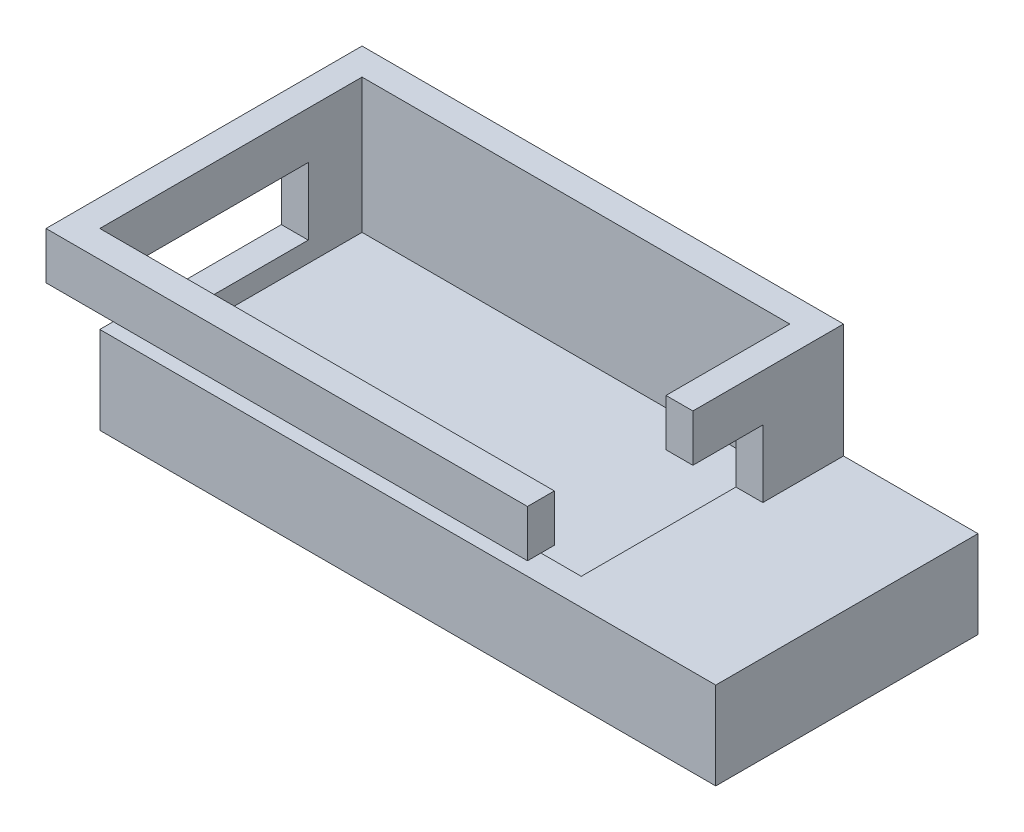
ISO-10303-21;
HEADER;
FILE_DESCRIPTION(('STEP AP214'),'2;1');
FILE_NAME('part.step','',(''),(''),'','','');
FILE_SCHEMA(('AUTOMOTIVE_DESIGN { 1 0 10303 214 1 1 1 1 }'));
ENDSEC;
DATA;
#1=APPLICATION_CONTEXT('core data for automotive mechanical design processes');
#2=APPLICATION_PROTOCOL_DEFINITION('international standard','automotive_design',2000,#1);
#3=PRODUCT_CONTEXT('',#1,'mechanical');
#4=PRODUCT('Part','Part','',(#3));
#5=PRODUCT_RELATED_PRODUCT_CATEGORY('part','',(#4));
#6=PRODUCT_DEFINITION_FORMATION('','',#4);
#7=PRODUCT_DEFINITION_CONTEXT('part definition',#1,'design');
#8=PRODUCT_DEFINITION('design','',#6,#7);
#9=PRODUCT_DEFINITION_SHAPE('','',#8);
#10=(LENGTH_UNIT() NAMED_UNIT(*) SI_UNIT(.MILLI.,.METRE.));
#11=(NAMED_UNIT(*) PLANE_ANGLE_UNIT() SI_UNIT($,.RADIAN.));
#12=(NAMED_UNIT(*) SI_UNIT($,.STERADIAN.) SOLID_ANGLE_UNIT());
#13=UNCERTAINTY_MEASURE_WITH_UNIT(LENGTH_MEASURE(1.E-05),#10,'distance_accuracy_value','');
#14=(GEOMETRIC_REPRESENTATION_CONTEXT(3) GLOBAL_UNCERTAINTY_ASSIGNED_CONTEXT((#13)) GLOBAL_UNIT_ASSIGNED_CONTEXT((#10,
#11,#12)) REPRESENTATION_CONTEXT('',''));
#15=CARTESIAN_POINT('',(0.,0.,0.));
#16=DIRECTION('',(0.,0.,1.));
#17=DIRECTION('',(1.,0.,0.));
#18=AXIS2_PLACEMENT_3D('',#15,#16,#17);
#19=CARTESIAN_POINT('',(-2.,6.5,-53.6474757071638));
#20=DIRECTION('',(0.,1.,0.));
#21=DIRECTION('',(-1.,0.,0.));
#22=AXIS2_PLACEMENT_3D('',#19,#20,#21);
#23=PLANE('',#22);
#24=DIRECTION('',(0.,0.,1.));
#25=VECTOR('',#24,1.);
#26=CARTESIAN_POINT('',(0.,6.5,0.));
#27=LINE('',#26,#25);
#28=CARTESIAN_POINT('',(0.,6.5,-11.5));
#29=VERTEX_POINT('',#28);
#30=CARTESIAN_POINT('',(0.,6.5,4.));
#31=VERTEX_POINT('',#30);
#32=EDGE_CURVE('E309',#29,#31,#27,.T.);
#33=ORIENTED_EDGE('',*,*,#32,.T.);
#34=DIRECTION('',(-1.,0.,0.));
#35=VECTOR('',#34,1.);
#36=CARTESIAN_POINT('',(0.,6.5,4.));
#37=LINE('',#36,#35);
#38=CARTESIAN_POINT('',(33.8,6.5,4.));
#39=VERTEX_POINT('',#38);
#40=EDGE_CURVE('E220',#39,#31,#37,.T.);
#41=ORIENTED_EDGE('',*,*,#40,.F.);
#42=DIRECTION('',(0.,0.,1.));
#43=VECTOR('',#42,1.);
#44=CARTESIAN_POINT('',(33.8,6.5,0.));
#45=LINE('',#44,#43);
#46=CARTESIAN_POINT('',(33.8,6.5,6.));
#47=VERTEX_POINT('',#46);
#48=EDGE_CURVE('E227',#39,#47,#45,.T.);
#49=ORIENTED_EDGE('',*,*,#48,.T.);
#50=DIRECTION('',(-1.,0.,0.));
#51=VECTOR('',#50,1.);
#52=CARTESIAN_POINT('',(0.,6.5,6.));
#53=LINE('',#52,#51);
#54=CARTESIAN_POINT('',(-2.,6.5,6.));
#55=VERTEX_POINT('',#54);
#56=EDGE_CURVE('E189',#47,#55,#53,.T.);
#57=ORIENTED_EDGE('',*,*,#56,.T.);
#58=DIRECTION('',(0.,0.,1.));
#59=VECTOR('',#58,1.);
#60=CARTESIAN_POINT('',(-2.,6.5,-53.6474757071638));
#61=LINE('',#60,#59);
#62=CARTESIAN_POINT('',(-2.,6.5,-11.5));
#63=VERTEX_POINT('',#62);
#64=EDGE_CURVE('E274',#63,#55,#61,.T.);
#65=ORIENTED_EDGE('',*,*,#64,.F.);
#66=DIRECTION('',(1.,0.,0.));
#67=VECTOR('',#66,1.);
#68=CARTESIAN_POINT('',(-2.,6.5,-11.5));
#69=LINE('',#68,#67);
#70=EDGE_CURVE('E275',#63,#29,#69,.T.);
#71=ORIENTED_EDGE('',*,*,#70,.T.);
#72=EDGE_LOOP('',(#33,#41,#49,#57,#65,#71));
#73=FACE_BOUND('',#72,.T.);
#74=ADVANCED_FACE('F49',(#73),#23,.F.);
#75=CARTESIAN_POINT('',(0.,10.,0.));
#76=DIRECTION('',(0.,1.,0.));
#77=DIRECTION('',(0.,0.,1.));
#78=AXIS2_PLACEMENT_3D('',#75,#76,#77);
#79=PLANE('',#78);
#80=DIRECTION('',(1.,0.,0.));
#81=VECTOR('',#80,1.);
#82=CARTESIAN_POINT('',(-9.00777441991085,10.,-6.30000000000001));
#83=LINE('',#82,#81);
#84=CARTESIAN_POINT('',(31.8,10.,-6.30000000000001));
#85=VERTEX_POINT('',#84);
#86=CARTESIAN_POINT('',(33.8,10.,-6.30000000000001));
#87=VERTEX_POINT('',#86);
#88=EDGE_CURVE('E263',#85,#87,#83,.T.);
#89=ORIENTED_EDGE('',*,*,#88,.T.);
#90=DIRECTION('',(0.,0.,-1.));
#91=VECTOR('',#90,1.);
#92=CARTESIAN_POINT('',(33.8,10.,2.));
#93=LINE('',#92,#91);
#94=CARTESIAN_POINT('',(33.8,10.,-17.5));
#95=VERTEX_POINT('',#94);
#96=EDGE_CURVE('E359',#87,#95,#93,.T.);
#97=ORIENTED_EDGE('',*,*,#96,.T.);
#98=DIRECTION('',(-1.,0.,0.));
#99=VECTOR('',#98,1.);
#100=CARTESIAN_POINT('',(-2.,10.,-17.5));
#101=LINE('',#100,#99);
#102=CARTESIAN_POINT('',(-2.,10.,-17.5));
#103=VERTEX_POINT('',#102);
#104=EDGE_CURVE('E362',#95,#103,#101,.T.);
#105=ORIENTED_EDGE('',*,*,#104,.T.);
#106=DIRECTION('',(0.,0.,1.));
#107=VECTOR('',#106,1.);
#108=CARTESIAN_POINT('',(-2.,10.,2.));
#109=LINE('',#108,#107);
#110=CARTESIAN_POINT('',(-2.,10.,6.));
#111=VERTEX_POINT('',#110);
#112=EDGE_CURVE('E208',#103,#111,#109,.T.);
#113=ORIENTED_EDGE('',*,*,#112,.T.);
#114=DIRECTION('',(1.,0.,0.));
#115=VECTOR('',#114,1.);
#116=CARTESIAN_POINT('',(0.,10.,6.));
#117=LINE('',#116,#115);
#118=CARTESIAN_POINT('',(33.8,10.,6.));
#119=VERTEX_POINT('',#118);
#120=EDGE_CURVE('E187',#111,#119,#117,.T.);
#121=ORIENTED_EDGE('',*,*,#120,.T.);
#122=DIRECTION('',(0.,0.,-1.));
#123=VECTOR('',#122,1.);
#124=CARTESIAN_POINT('',(33.8,10.,0.));
#125=LINE('',#124,#123);
#126=CARTESIAN_POINT('',(33.8,10.,4.));
#127=VERTEX_POINT('',#126);
#128=EDGE_CURVE('E197',#119,#127,#125,.T.);
#129=ORIENTED_EDGE('',*,*,#128,.T.);
#130=DIRECTION('',(1.,0.,0.));
#131=VECTOR('',#130,1.);
#132=CARTESIAN_POINT('',(0.,10.,4.));
#133=LINE('',#132,#131);
#134=CARTESIAN_POINT('',(0.,10.,4.));
#135=VERTEX_POINT('',#134);
#136=EDGE_CURVE('E194',#135,#127,#133,.T.);
#137=ORIENTED_EDGE('',*,*,#136,.F.);
#138=DIRECTION('',(0.,0.,1.));
#139=VECTOR('',#138,1.);
#140=CARTESIAN_POINT('',(0.,10.,0.));
#141=LINE('',#140,#139);
#142=CARTESIAN_POINT('',(0.,10.,-15.5));
#143=VERTEX_POINT('',#142);
#144=EDGE_CURVE('E323',#143,#135,#141,.T.);
#145=ORIENTED_EDGE('',*,*,#144,.F.);
#146=DIRECTION('',(-1.,0.,0.));
#147=VECTOR('',#146,1.);
#148=CARTESIAN_POINT('',(0.,10.,-15.5));
#149=LINE('',#148,#147);
#150=CARTESIAN_POINT('',(31.8,10.,-15.5));
#151=VERTEX_POINT('',#150);
#152=EDGE_CURVE('E330',#151,#143,#149,.T.);
#153=ORIENTED_EDGE('',*,*,#152,.F.);
#154=DIRECTION('',(0.,0.,-1.));
#155=VECTOR('',#154,1.);
#156=CARTESIAN_POINT('',(31.8,10.,0.));
#157=LINE('',#156,#155);
#158=EDGE_CURVE('E326',#85,#151,#157,.T.);
#159=ORIENTED_EDGE('',*,*,#158,.F.);
#160=EDGE_LOOP('',(#89,#97,#105,#113,#121,#129,#137,#145,#153,#159));
#161=FACE_BOUND('',#160,.T.);
#162=ADVANCED_FACE('F206',(#161),#79,.T.);
#163=CARTESIAN_POINT('',(-2.,10.,2.));
#164=DIRECTION('',(0.,0.,-1.));
#165=DIRECTION('',(-1.,0.,0.));
#166=AXIS2_PLACEMENT_3D('',#163,#164,#165);
#167=PLANE('',#166);
#168=DIRECTION('',(1.,0.,0.));
#169=VECTOR('',#168,1.);
#170=CARTESIAN_POINT('',(0.,-5.,2.));
#171=LINE('',#170,#169);
#172=CARTESIAN_POINT('',(-2.,-5.,2.));
#173=VERTEX_POINT('',#172);
#174=CARTESIAN_POINT('',(43.8,-5.,2.));
#175=VERTEX_POINT('',#174);
#176=EDGE_CURVE('E316',#173,#175,#171,.T.);
#177=ORIENTED_EDGE('',*,*,#176,.T.);
#178=DIRECTION('',(0.,-1.,0.));
#179=VECTOR('',#178,1.);
#180=CARTESIAN_POINT('',(43.8,23.4146070008111,2.));
#181=LINE('',#180,#179);
#182=CARTESIAN_POINT('',(43.8,1.5,2.));
#183=VERTEX_POINT('',#182);
#184=EDGE_CURVE('E254',#183,#175,#181,.T.);
#185=ORIENTED_EDGE('',*,*,#184,.F.);
#186=DIRECTION('',(1.,0.,0.));
#187=VECTOR('',#186,1.);
#188=CARTESIAN_POINT('',(-2.,1.5,2.));
#189=LINE('',#188,#187);
#190=CARTESIAN_POINT('',(-2.,1.5,2.));
#191=VERTEX_POINT('',#190);
#192=EDGE_CURVE('E268',#191,#183,#189,.T.);
#193=ORIENTED_EDGE('',*,*,#192,.F.);
#194=DIRECTION('',(0.,-1.,0.));
#195=VECTOR('',#194,1.);
#196=CARTESIAN_POINT('',(-2.,10.,2.));
#197=LINE('',#196,#195);
#198=EDGE_CURVE('E367',#191,#173,#197,.T.);
#199=ORIENTED_EDGE('',*,*,#198,.T.);
#200=EDGE_LOOP('',(#177,#185,#193,#199));
#201=FACE_BOUND('',#200,.T.);
#202=ADVANCED_FACE('F51',(#201),#167,.F.);
#203=CARTESIAN_POINT('',(33.8,10.,2.));
#204=DIRECTION('',(-1.,0.,0.));
#205=DIRECTION('',(0.,0.,1.));
#206=AXIS2_PLACEMENT_3D('',#203,#204,#205);
#207=PLANE('',#206);
#208=DIRECTION('',(0.,-1.,0.));
#209=VECTOR('',#208,1.);
#210=CARTESIAN_POINT('',(33.8,6.5,-11.5));
#211=LINE('',#210,#209);
#212=CARTESIAN_POINT('',(33.8,6.5,-11.5));
#213=VERTEX_POINT('',#212);
#214=CARTESIAN_POINT('',(33.8,1.5,-11.5));
#215=VERTEX_POINT('',#214);
#216=EDGE_CURVE('E269',#213,#215,#211,.T.);
#217=ORIENTED_EDGE('',*,*,#216,.T.);
#218=DIRECTION('',(0.,0.,-1.));
#219=VECTOR('',#218,1.);
#220=CARTESIAN_POINT('',(33.8,1.5,0.));
#221=LINE('',#220,#219);
#222=CARTESIAN_POINT('',(33.8,1.5,-17.5));
#223=VERTEX_POINT('',#222);
#224=EDGE_CURVE('E239',#215,#223,#221,.T.);
#225=ORIENTED_EDGE('',*,*,#224,.T.);
#226=DIRECTION('',(0.,-1.,0.));
#227=VECTOR('',#226,1.);
#228=CARTESIAN_POINT('',(33.8,10.,-17.5));
#229=LINE('',#228,#227);
#230=EDGE_CURVE('E373',#95,#223,#229,.T.);
#231=ORIENTED_EDGE('',*,*,#230,.F.);
#232=ORIENTED_EDGE('',*,*,#96,.F.);
#233=DIRECTION('',(0.,1.,0.));
#234=VECTOR('',#233,1.);
#235=CARTESIAN_POINT('',(33.8,6.5,-6.30000000000001));
#236=LINE('',#235,#234);
#237=CARTESIAN_POINT('',(33.8,6.5,-6.30000000000001));
#238=VERTEX_POINT('',#237);
#239=EDGE_CURVE('E250',#238,#87,#236,.T.);
#240=ORIENTED_EDGE('',*,*,#239,.F.);
#241=DIRECTION('',(0.,0.,1.));
#242=VECTOR('',#241,1.);
#243=CARTESIAN_POINT('',(33.8,6.5,-53.6474757071638));
#244=LINE('',#243,#242);
#245=EDGE_CURVE('E289',#213,#238,#244,.T.);
#246=ORIENTED_EDGE('',*,*,#245,.F.);
#247=EDGE_LOOP('',(#217,#225,#231,#232,#240,#246));
#248=FACE_BOUND('',#247,.T.);
#249=ADVANCED_FACE('F465',(#248),#207,.F.);
#250=CARTESIAN_POINT('',(-2.,10.,-17.5));
#251=DIRECTION('',(0.,0.,1.));
#252=DIRECTION('',(1.,0.,0.));
#253=AXIS2_PLACEMENT_3D('',#250,#251,#252);
#254=PLANE('',#253);
#255=ORIENTED_EDGE('',*,*,#230,.T.);
#256=DIRECTION('',(-1.,0.,0.));
#257=VECTOR('',#256,1.);
#258=CARTESIAN_POINT('',(0.,1.5,-17.5));
#259=LINE('',#258,#257);
#260=CARTESIAN_POINT('',(43.8,1.5,-17.5));
#261=VERTEX_POINT('',#260);
#262=EDGE_CURVE('E65',#261,#223,#259,.T.);
#263=ORIENTED_EDGE('',*,*,#262,.F.);
#264=DIRECTION('',(0.,-1.,0.));
#265=VECTOR('',#264,1.);
#266=CARTESIAN_POINT('',(43.8,23.4146070008111,-17.5));
#267=LINE('',#266,#265);
#268=CARTESIAN_POINT('',(43.8,-5.,-17.5));
#269=VERTEX_POINT('',#268);
#270=EDGE_CURVE('E246',#261,#269,#267,.T.);
#271=ORIENTED_EDGE('',*,*,#270,.T.);
#272=DIRECTION('',(1.,0.,0.));
#273=VECTOR('',#272,1.);
#274=CARTESIAN_POINT('',(0.,-5.,-17.5));
#275=LINE('',#274,#273);
#276=CARTESIAN_POINT('',(-2.,-5.,-17.5));
#277=VERTEX_POINT('',#276);
#278=EDGE_CURVE('E319',#277,#269,#275,.T.);
#279=ORIENTED_EDGE('',*,*,#278,.F.);
#280=DIRECTION('',(0.,-1.,0.));
#281=VECTOR('',#280,1.);
#282=CARTESIAN_POINT('',(-2.,10.,-17.5));
#283=LINE('',#282,#281);
#284=EDGE_CURVE('E370',#103,#277,#283,.T.);
#285=ORIENTED_EDGE('',*,*,#284,.F.);
#286=ORIENTED_EDGE('',*,*,#104,.F.);
#287=EDGE_LOOP('',(#255,#263,#271,#279,#285,#286));
#288=FACE_BOUND('',#287,.T.);
#289=ADVANCED_FACE('F412',(#288),#254,.F.);
#290=CARTESIAN_POINT('',(-2.,10.,2.));
#291=DIRECTION('',(1.,0.,0.));
#292=DIRECTION('',(0.,0.,-1.));
#293=AXIS2_PLACEMENT_3D('',#290,#291,#292);
#294=PLANE('',#293);
#295=DIRECTION('',(0.,1.,0.));
#296=VECTOR('',#295,1.);
#297=CARTESIAN_POINT('',(-2.,6.5,-11.5));
#298=LINE('',#297,#296);
#299=CARTESIAN_POINT('',(-2.,1.5,-11.5));
#300=VERTEX_POINT('',#299);
#301=EDGE_CURVE('E279',#300,#63,#298,.T.);
#302=ORIENTED_EDGE('',*,*,#301,.T.);
#303=ORIENTED_EDGE('',*,*,#64,.T.);
#304=DIRECTION('',(0.,1.,0.));
#305=VECTOR('',#304,1.);
#306=CARTESIAN_POINT('',(-2.,-29.5227705764007,6.));
#307=LINE('',#306,#305);
#308=EDGE_CURVE('E217',#55,#111,#307,.T.);
#309=ORIENTED_EDGE('',*,*,#308,.T.);
#310=ORIENTED_EDGE('',*,*,#112,.F.);
#311=ORIENTED_EDGE('',*,*,#284,.T.);
#312=DIRECTION('',(0.,0.,-1.));
#313=VECTOR('',#312,1.);
#314=CARTESIAN_POINT('',(-2.,-5.,0.));
#315=LINE('',#314,#313);
#316=EDGE_CURVE('E312',#173,#277,#315,.T.);
#317=ORIENTED_EDGE('',*,*,#316,.F.);
#318=ORIENTED_EDGE('',*,*,#198,.F.);
#319=DIRECTION('',(0.,0.,1.));
#320=VECTOR('',#319,1.);
#321=CARTESIAN_POINT('',(-2.,1.5,-53.6474757071638));
#322=LINE('',#321,#320);
#323=EDGE_CURVE('E286',#300,#191,#322,.T.);
#324=ORIENTED_EDGE('',*,*,#323,.F.);
#325=EDGE_LOOP('',(#302,#303,#309,#310,#311,#317,#318,#324));
#326=FACE_BOUND('',#325,.T.);
#327=ADVANCED_FACE('F407',(#326),#294,.F.);
#328=CARTESIAN_POINT('',(0.,10.,0.));
#329=DIRECTION('',(1.,0.,0.));
#330=DIRECTION('',(0.,0.,-1.));
#331=AXIS2_PLACEMENT_3D('',#328,#329,#330);
#332=PLANE('',#331);
#333=ORIENTED_EDGE('',*,*,#144,.T.);
#334=DIRECTION('',(0.,1.,0.));
#335=VECTOR('',#334,1.);
#336=CARTESIAN_POINT('',(0.,-29.5227705764007,4.));
#337=LINE('',#336,#335);
#338=EDGE_CURVE('E221',#31,#135,#337,.T.);
#339=ORIENTED_EDGE('',*,*,#338,.F.);
#340=ORIENTED_EDGE('',*,*,#32,.F.);
#341=DIRECTION('',(0.,-1.,0.));
#342=VECTOR('',#341,1.);
#343=CARTESIAN_POINT('',(0.,10.,-11.5));
#344=LINE('',#343,#342);
#345=CARTESIAN_POINT('',(0.,1.5,-11.5));
#346=VERTEX_POINT('',#345);
#347=EDGE_CURVE('E299',#29,#346,#344,.T.);
#348=ORIENTED_EDGE('',*,*,#347,.T.);
#349=DIRECTION('',(0.,0.,-1.));
#350=VECTOR('',#349,1.);
#351=CARTESIAN_POINT('',(0.,1.5,0.));
#352=LINE('',#351,#350);
#353=CARTESIAN_POINT('',(0.,1.5,0.));
#354=VERTEX_POINT('',#353);
#355=EDGE_CURVE('E306',#354,#346,#352,.T.);
#356=ORIENTED_EDGE('',*,*,#355,.F.);
#357=DIRECTION('',(0.,-1.,0.));
#358=VECTOR('',#357,1.);
#359=CARTESIAN_POINT('',(0.,10.,0.));
#360=LINE('',#359,#358);
#361=CARTESIAN_POINT('',(0.,0.,0.));
#362=VERTEX_POINT('',#361);
#363=EDGE_CURVE('E356',#354,#362,#360,.T.);
#364=ORIENTED_EDGE('',*,*,#363,.T.);
#365=DIRECTION('',(0.,0.,1.));
#366=VECTOR('',#365,1.);
#367=CARTESIAN_POINT('',(0.,0.,0.));
#368=LINE('',#367,#366);
#369=CARTESIAN_POINT('',(0.,0.,-15.5));
#370=VERTEX_POINT('',#369);
#371=EDGE_CURVE('E322',#370,#362,#368,.T.);
#372=ORIENTED_EDGE('',*,*,#371,.F.);
#373=DIRECTION('',(0.,-1.,0.));
#374=VECTOR('',#373,1.);
#375=CARTESIAN_POINT('',(0.,10.,-15.5));
#376=LINE('',#375,#374);
#377=EDGE_CURVE('E333',#143,#370,#376,.T.);
#378=ORIENTED_EDGE('',*,*,#377,.F.);
#379=EDGE_LOOP('',(#333,#339,#340,#348,#356,#364,#372,#378));
#380=FACE_BOUND('',#379,.T.);
#381=ADVANCED_FACE('F429',(#380),#332,.T.);
#382=CARTESIAN_POINT('',(0.,10.,0.));
#383=DIRECTION('',(0.,0.,-1.));
#384=DIRECTION('',(-1.,0.,0.));
#385=AXIS2_PLACEMENT_3D('',#382,#383,#384);
#386=PLANE('',#385);
#387=DIRECTION('',(-1.,0.,0.));
#388=VECTOR('',#387,1.);
#389=CARTESIAN_POINT('',(0.,1.5,0.));
#390=LINE('',#389,#388);
#391=CARTESIAN_POINT('',(31.8,1.5,0.));
#392=VERTEX_POINT('',#391);
#393=EDGE_CURVE('E303',#392,#354,#390,.T.);
#394=ORIENTED_EDGE('',*,*,#393,.F.);
#395=DIRECTION('',(0.,-1.,0.));
#396=VECTOR('',#395,1.);
#397=CARTESIAN_POINT('',(31.8,10.,0.));
#398=LINE('',#397,#396);
#399=CARTESIAN_POINT('',(31.8,0.,0.));
#400=VERTEX_POINT('',#399);
#401=EDGE_CURVE('E353',#392,#400,#398,.T.);
#402=ORIENTED_EDGE('',*,*,#401,.T.);
#403=DIRECTION('',(1.,0.,0.));
#404=VECTOR('',#403,1.);
#405=CARTESIAN_POINT('',(0.,0.,0.));
#406=LINE('',#405,#404);
#407=EDGE_CURVE('E337',#362,#400,#406,.T.);
#408=ORIENTED_EDGE('',*,*,#407,.F.);
#409=ORIENTED_EDGE('',*,*,#363,.F.);
#410=EDGE_LOOP('',(#394,#402,#408,#409));
#411=FACE_BOUND('',#410,.T.);
#412=ADVANCED_FACE('F471',(#411),#386,.T.);
#413=CARTESIAN_POINT('',(31.8,10.,0.));
#414=DIRECTION('',(-1.,0.,0.));
#415=DIRECTION('',(0.,0.,1.));
#416=AXIS2_PLACEMENT_3D('',#413,#414,#415);
#417=PLANE('',#416);
#418=DIRECTION('',(0.,-1.,0.));
#419=VECTOR('',#418,1.);
#420=CARTESIAN_POINT('',(31.8,10.,-6.30000000000001));
#421=LINE('',#420,#419);
#422=CARTESIAN_POINT('',(31.8,6.5,-6.30000000000001));
#423=VERTEX_POINT('',#422);
#424=EDGE_CURVE('E73',#85,#423,#421,.T.);
#425=ORIENTED_EDGE('',*,*,#424,.F.);
#426=ORIENTED_EDGE('',*,*,#158,.T.);
#427=DIRECTION('',(0.,-1.,0.));
#428=VECTOR('',#427,1.);
#429=CARTESIAN_POINT('',(31.8,10.,-15.5));
#430=LINE('',#429,#428);
#431=CARTESIAN_POINT('',(31.8,0.,-15.5));
#432=VERTEX_POINT('',#431);
#433=EDGE_CURVE('E350',#151,#432,#430,.T.);
#434=ORIENTED_EDGE('',*,*,#433,.T.);
#435=DIRECTION('',(0.,0.,-1.));
#436=VECTOR('',#435,1.);
#437=CARTESIAN_POINT('',(31.8,0.,0.));
#438=LINE('',#437,#436);
#439=EDGE_CURVE('E341',#400,#432,#438,.T.);
#440=ORIENTED_EDGE('',*,*,#439,.F.);
#441=ORIENTED_EDGE('',*,*,#401,.F.);
#442=DIRECTION('',(0.,0.,1.));
#443=VECTOR('',#442,1.);
#444=CARTESIAN_POINT('',(31.8,1.5,0.));
#445=LINE('',#444,#443);
#446=CARTESIAN_POINT('',(31.8,1.5,-11.5));
#447=VERTEX_POINT('',#446);
#448=EDGE_CURVE('E381',#447,#392,#445,.T.);
#449=ORIENTED_EDGE('',*,*,#448,.F.);
#450=DIRECTION('',(0.,1.,0.));
#451=VECTOR('',#450,1.);
#452=CARTESIAN_POINT('',(31.8,10.,-11.5));
#453=LINE('',#452,#451);
#454=CARTESIAN_POINT('',(31.8,6.5,-11.5));
#455=VERTEX_POINT('',#454);
#456=EDGE_CURVE('E377',#447,#455,#453,.T.);
#457=ORIENTED_EDGE('',*,*,#456,.T.);
#458=DIRECTION('',(0.,0.,-1.));
#459=VECTOR('',#458,1.);
#460=CARTESIAN_POINT('',(31.8,6.5,0.));
#461=LINE('',#460,#459);
#462=EDGE_CURVE('E384',#423,#455,#461,.T.);
#463=ORIENTED_EDGE('',*,*,#462,.F.);
#464=EDGE_LOOP('',(#425,#426,#434,#440,#441,#449,#457,#463));
#465=FACE_BOUND('',#464,.T.);
#466=ADVANCED_FACE('F448',(#465),#417,.T.);
#467=CARTESIAN_POINT('',(0.,10.,-15.5));
#468=DIRECTION('',(0.,0.,1.));
#469=DIRECTION('',(1.,0.,0.));
#470=AXIS2_PLACEMENT_3D('',#467,#468,#469);
#471=PLANE('',#470);
#472=DIRECTION('',(-1.,0.,0.));
#473=VECTOR('',#472,1.);
#474=CARTESIAN_POINT('',(0.,0.,-15.5));
#475=LINE('',#474,#473);
#476=EDGE_CURVE('E327',#432,#370,#475,.T.);
#477=ORIENTED_EDGE('',*,*,#476,.F.);
#478=ORIENTED_EDGE('',*,*,#433,.F.);
#479=ORIENTED_EDGE('',*,*,#152,.T.);
#480=ORIENTED_EDGE('',*,*,#377,.T.);
#481=EDGE_LOOP('',(#477,#478,#479,#480));
#482=FACE_BOUND('',#481,.T.);
#483=ADVANCED_FACE('F440',(#482),#471,.T.);
#484=CARTESIAN_POINT('',(0.,0.,0.));
#485=DIRECTION('',(0.,1.,0.));
#486=DIRECTION('',(0.,0.,1.));
#487=AXIS2_PLACEMENT_3D('',#484,#485,#486);
#488=PLANE('',#487);
#489=ORIENTED_EDGE('',*,*,#476,.T.);
#490=ORIENTED_EDGE('',*,*,#371,.T.);
#491=ORIENTED_EDGE('',*,*,#407,.T.);
#492=ORIENTED_EDGE('',*,*,#439,.T.);
#493=EDGE_LOOP('',(#489,#490,#491,#492));
#494=FACE_BOUND('',#493,.T.);
#495=ADVANCED_FACE('F398',(#494),#488,.T.);
#496=CARTESIAN_POINT('',(0.,-5.,0.));
#497=DIRECTION('',(0.,1.,0.));
#498=DIRECTION('',(0.,0.,1.));
#499=AXIS2_PLACEMENT_3D('',#496,#497,#498);
#500=PLANE('',#499);
#501=CARTESIAN_POINT('',(33.4,-5.,-7.75));
#502=DIRECTION('',(0.,1.,0.));
#503=DIRECTION('',(0.,0.,1.));
#504=AXIS2_PLACEMENT_3D('',#501,#502,#503);
#505=CIRCLE('',#504,2.49999999999999);
#506=CARTESIAN_POINT('',(33.4,-5.,-5.25));
#507=VERTEX_POINT('',#506);
#508=EDGE_CURVE('E12',#507,#507,#505,.F.);
#509=ORIENTED_EDGE('',*,*,#508,.F.);
#510=EDGE_LOOP('',(#509));
#511=FACE_BOUND('',#510,.T.);
#512=CARTESIAN_POINT('',(8.4,-5.,-7.75));
#513=DIRECTION('',(0.,1.,0.));
#514=DIRECTION('',(0.,0.,1.));
#515=AXIS2_PLACEMENT_3D('',#512,#513,#514);
#516=CIRCLE('',#515,2.5);
#517=CARTESIAN_POINT('',(8.4,-5.,-5.25));
#518=VERTEX_POINT('',#517);
#519=EDGE_CURVE('E58',#518,#518,#516,.F.);
#520=ORIENTED_EDGE('',*,*,#519,.F.);
#521=EDGE_LOOP('',(#520));
#522=FACE_BOUND('',#521,.T.);
#523=ORIENTED_EDGE('',*,*,#316,.T.);
#524=ORIENTED_EDGE('',*,*,#278,.T.);
#525=DIRECTION('',(0.,0.,-1.));
#526=VECTOR('',#525,1.);
#527=CARTESIAN_POINT('',(43.8,-5.,0.));
#528=LINE('',#527,#526);
#529=EDGE_CURVE('E238',#175,#269,#528,.T.);
#530=ORIENTED_EDGE('',*,*,#529,.F.);
#531=ORIENTED_EDGE('',*,*,#176,.F.);
#532=EDGE_LOOP('',(#523,#524,#530,#531));
#533=FACE_BOUND('',#532,.T.);
#534=ADVANCED_FACE('F394',(#511,#522,#533),#500,.F.);
#535=CARTESIAN_POINT('',(-2.,10.,-11.5));
#536=DIRECTION('',(0.,0.,1.));
#537=DIRECTION('',(1.,0.,0.));
#538=AXIS2_PLACEMENT_3D('',#535,#536,#537);
#539=PLANE('',#538);
#540=ORIENTED_EDGE('',*,*,#70,.F.);
#541=ORIENTED_EDGE('',*,*,#301,.F.);
#542=DIRECTION('',(-1.,0.,0.));
#543=VECTOR('',#542,1.);
#544=CARTESIAN_POINT('',(-2.,1.5,-11.5));
#545=LINE('',#544,#543);
#546=EDGE_CURVE('E283',#346,#300,#545,.T.);
#547=ORIENTED_EDGE('',*,*,#546,.F.);
#548=ORIENTED_EDGE('',*,*,#347,.F.);
#549=EDGE_LOOP('',(#540,#541,#547,#548));
#550=FACE_BOUND('',#549,.T.);
#551=ADVANCED_FACE('F397',(#550),#539,.T.);
#552=ORIENTED_EDGE('',*,*,#245,.T.);
#553=DIRECTION('',(-1.,0.,0.));
#554=VECTOR('',#553,1.);
#555=CARTESIAN_POINT('',(-2.,6.5,-6.30000000000001));
#556=LINE('',#555,#554);
#557=EDGE_CURVE('E242',#238,#423,#556,.T.);
#558=ORIENTED_EDGE('',*,*,#557,.T.);
#559=ORIENTED_EDGE('',*,*,#462,.T.);
#560=EDGE_CURVE('E273',#455,#213,#69,.T.);
#561=ORIENTED_EDGE('',*,*,#560,.T.);
#562=EDGE_LOOP('',(#552,#558,#559,#561));
#563=FACE_BOUND('',#562,.T.);
#564=ADVANCED_FACE('F453',(#563),#23,.F.);
#565=CARTESIAN_POINT('',(-2.,1.5,-53.6474757071638));
#566=DIRECTION('',(0.,-1.,0.));
#567=DIRECTION('',(0.,0.,-1.));
#568=AXIS2_PLACEMENT_3D('',#565,#566,#567);
#569=PLANE('',#568);
#570=ORIENTED_EDGE('',*,*,#355,.T.);
#571=ORIENTED_EDGE('',*,*,#546,.T.);
#572=ORIENTED_EDGE('',*,*,#323,.T.);
#573=ORIENTED_EDGE('',*,*,#192,.T.);
#574=DIRECTION('',(0.,0.,1.));
#575=VECTOR('',#574,1.);
#576=CARTESIAN_POINT('',(43.8,1.5,0.));
#577=LINE('',#576,#575);
#578=EDGE_CURVE('E245',#261,#183,#577,.T.);
#579=ORIENTED_EDGE('',*,*,#578,.F.);
#580=ORIENTED_EDGE('',*,*,#262,.T.);
#581=ORIENTED_EDGE('',*,*,#224,.F.);
#582=EDGE_CURVE('E295',#215,#447,#545,.T.);
#583=ORIENTED_EDGE('',*,*,#582,.T.);
#584=ORIENTED_EDGE('',*,*,#448,.T.);
#585=ORIENTED_EDGE('',*,*,#393,.T.);
#586=EDGE_LOOP('',(#570,#571,#572,#573,#579,#580,#581,#583,#584,#585));
#587=FACE_BOUND('',#586,.T.);
#588=ADVANCED_FACE('F419',(#587),#569,.F.);
#589=ORIENTED_EDGE('',*,*,#582,.F.);
#590=ORIENTED_EDGE('',*,*,#216,.F.);
#591=ORIENTED_EDGE('',*,*,#560,.F.);
#592=ORIENTED_EDGE('',*,*,#456,.F.);
#593=EDGE_LOOP('',(#589,#590,#591,#592));
#594=FACE_BOUND('',#593,.T.);
#595=ADVANCED_FACE('F457',(#594),#539,.T.);
#596=CARTESIAN_POINT('',(-9.00777441991085,6.5,-6.30000000000001));
#597=DIRECTION('',(0.,0.,-1.));
#598=DIRECTION('',(-1.,0.,0.));
#599=AXIS2_PLACEMENT_3D('',#596,#597,#598);
#600=PLANE('',#599);
#601=ORIENTED_EDGE('',*,*,#424,.T.);
#602=ORIENTED_EDGE('',*,*,#557,.F.);
#603=ORIENTED_EDGE('',*,*,#239,.T.);
#604=ORIENTED_EDGE('',*,*,#88,.F.);
#605=EDGE_LOOP('',(#601,#602,#603,#604));
#606=FACE_BOUND('',#605,.T.);
#607=ADVANCED_FACE('F468',(#606),#600,.F.);
#608=CARTESIAN_POINT('',(43.8,23.4146070008111,0.));
#609=DIRECTION('',(-1.,0.,0.));
#610=DIRECTION('',(0.,0.,1.));
#611=AXIS2_PLACEMENT_3D('',#608,#609,#610);
#612=PLANE('',#611);
#613=ORIENTED_EDGE('',*,*,#270,.F.);
#614=ORIENTED_EDGE('',*,*,#578,.T.);
#615=ORIENTED_EDGE('',*,*,#184,.T.);
#616=ORIENTED_EDGE('',*,*,#529,.T.);
#617=EDGE_LOOP('',(#613,#614,#615,#616));
#618=FACE_BOUND('',#617,.T.);
#619=ADVANCED_FACE('F415',(#618),#612,.F.);
#620=CARTESIAN_POINT('',(8.4,-10.,-7.75));
#621=DIRECTION('',(0.,1.,0.));
#622=DIRECTION('',(0.,0.,1.));
#623=AXIS2_PLACEMENT_3D('',#620,#621,#622);
#624=CYLINDRICAL_SURFACE('',#623,2.5);
#625=CARTESIAN_POINT('',(8.4,-10.,-7.75));
#626=DIRECTION('',(0.,-1.,0.));
#627=DIRECTION('',(0.,0.,-1.));
#628=AXIS2_PLACEMENT_3D('',#625,#626,#627);
#629=CIRCLE('',#628,2.5);
#630=CARTESIAN_POINT('',(8.4,-10.,-10.25));
#631=VERTEX_POINT('',#630);
#632=EDGE_CURVE('E234',#631,#631,#629,.T.);
#633=ORIENTED_EDGE('',*,*,#632,.F.);
#634=EDGE_LOOP('',(#633));
#635=FACE_BOUND('',#634,.T.);
#636=ORIENTED_EDGE('',*,*,#519,.T.);
#637=EDGE_LOOP('',(#636));
#638=FACE_BOUND('',#637,.T.);
#639=ADVANCED_FACE('F392',(#635,#638),#624,.T.);
#640=CARTESIAN_POINT('',(8.4,-10.,-7.75));
#641=DIRECTION('',(0.,-1.,0.));
#642=DIRECTION('',(0.,0.,-1.));
#643=AXIS2_PLACEMENT_3D('',#640,#641,#642);
#644=PLANE('',#643);
#645=ORIENTED_EDGE('',*,*,#632,.T.);
#646=EDGE_LOOP('',(#645));
#647=FACE_BOUND('',#646,.T.);
#648=ADVANCED_FACE('F510',(#647),#644,.T.);
#649=CARTESIAN_POINT('',(33.4,-10.,-7.75));
#650=DIRECTION('',(0.,1.,0.));
#651=DIRECTION('',(0.,0.,1.));
#652=AXIS2_PLACEMENT_3D('',#649,#650,#651);
#653=CYLINDRICAL_SURFACE('',#652,2.49999999999999);
#654=CARTESIAN_POINT('',(33.4,-10.,-7.75));
#655=DIRECTION('',(0.,-1.,0.));
#656=DIRECTION('',(0.,0.,1.));
#657=AXIS2_PLACEMENT_3D('',#654,#655,#656);
#658=CIRCLE('',#657,2.49999999999999);
#659=CARTESIAN_POINT('',(33.4,-10.,-5.25));
#660=VERTEX_POINT('',#659);
#661=EDGE_CURVE('E230',#660,#660,#658,.T.);
#662=ORIENTED_EDGE('',*,*,#661,.F.);
#663=EDGE_LOOP('',(#662));
#664=FACE_BOUND('',#663,.T.);
#665=ORIENTED_EDGE('',*,*,#508,.T.);
#666=EDGE_LOOP('',(#665));
#667=FACE_BOUND('',#666,.T.);
#668=ADVANCED_FACE('F514',(#664,#667),#653,.T.);
#669=CARTESIAN_POINT('',(33.4,-10.,-7.75));
#670=DIRECTION('',(0.,1.,0.));
#671=DIRECTION('',(0.,0.,1.));
#672=AXIS2_PLACEMENT_3D('',#669,#670,#671);
#673=PLANE('',#672);
#674=ORIENTED_EDGE('',*,*,#661,.T.);
#675=EDGE_LOOP('',(#674));
#676=FACE_BOUND('',#675,.T.);
#677=ADVANCED_FACE('F516',(#676),#673,.F.);
#678=CARTESIAN_POINT('',(0.,-29.5227705764007,6.));
#679=DIRECTION('',(0.,0.,1.));
#680=DIRECTION('',(1.,0.,0.));
#681=AXIS2_PLACEMENT_3D('',#678,#679,#680);
#682=PLANE('',#681);
#683=ORIENTED_EDGE('',*,*,#56,.F.);
#684=DIRECTION('',(0.,1.,0.));
#685=VECTOR('',#684,1.);
#686=CARTESIAN_POINT('',(33.8,-29.5227705764007,6.));
#687=LINE('',#686,#685);
#688=EDGE_CURVE('E182',#47,#119,#687,.T.);
#689=ORIENTED_EDGE('',*,*,#688,.T.);
#690=ORIENTED_EDGE('',*,*,#120,.F.);
#691=ORIENTED_EDGE('',*,*,#308,.F.);
#692=EDGE_LOOP('',(#683,#689,#690,#691));
#693=FACE_BOUND('',#692,.T.);
#694=ADVANCED_FACE('F184',(#693),#682,.T.);
#695=CARTESIAN_POINT('',(0.,-29.5227705764007,4.));
#696=DIRECTION('',(0.,0.,1.));
#697=DIRECTION('',(1.,0.,0.));
#698=AXIS2_PLACEMENT_3D('',#695,#696,#697);
#699=PLANE('',#698);
#700=DIRECTION('',(0.,1.,0.));
#701=VECTOR('',#700,1.);
#702=CARTESIAN_POINT('',(33.8,-29.5227705764007,4.));
#703=LINE('',#702,#701);
#704=EDGE_CURVE('E193',#39,#127,#703,.T.);
#705=ORIENTED_EDGE('',*,*,#704,.F.);
#706=ORIENTED_EDGE('',*,*,#40,.T.);
#707=ORIENTED_EDGE('',*,*,#338,.T.);
#708=ORIENTED_EDGE('',*,*,#136,.T.);
#709=EDGE_LOOP('',(#705,#706,#707,#708));
#710=FACE_BOUND('',#709,.T.);
#711=ADVANCED_FACE('F434',(#710),#699,.F.);
#712=CARTESIAN_POINT('',(33.8,-29.5227705764007,0.));
#713=DIRECTION('',(1.,0.,0.));
#714=DIRECTION('',(0.,0.,-1.));
#715=AXIS2_PLACEMENT_3D('',#712,#713,#714);
#716=PLANE('',#715);
#717=ORIENTED_EDGE('',*,*,#48,.F.);
#718=ORIENTED_EDGE('',*,*,#704,.T.);
#719=ORIENTED_EDGE('',*,*,#128,.F.);
#720=ORIENTED_EDGE('',*,*,#688,.F.);
#721=EDGE_LOOP('',(#717,#718,#719,#720));
#722=FACE_BOUND('',#721,.T.);
#723=ADVANCED_FACE('F198',(#722),#716,.T.);
#724=CLOSED_SHELL('',(#74,#162,#202,#249,#289,#327,#381,#412,#466,#483,#495,#534,#551,#564,#588,
#595,#607,#619,#639,#648,#668,#677,#694,#711,#723));
#725=MANIFOLD_SOLID_BREP('B2',#724);
#726=ADVANCED_BREP_SHAPE_REPRESENTATION('',(#18,#725),#14);
#727=SHAPE_DEFINITION_REPRESENTATION(#9,#726);
ENDSEC;
END-ISO-10303-21;
